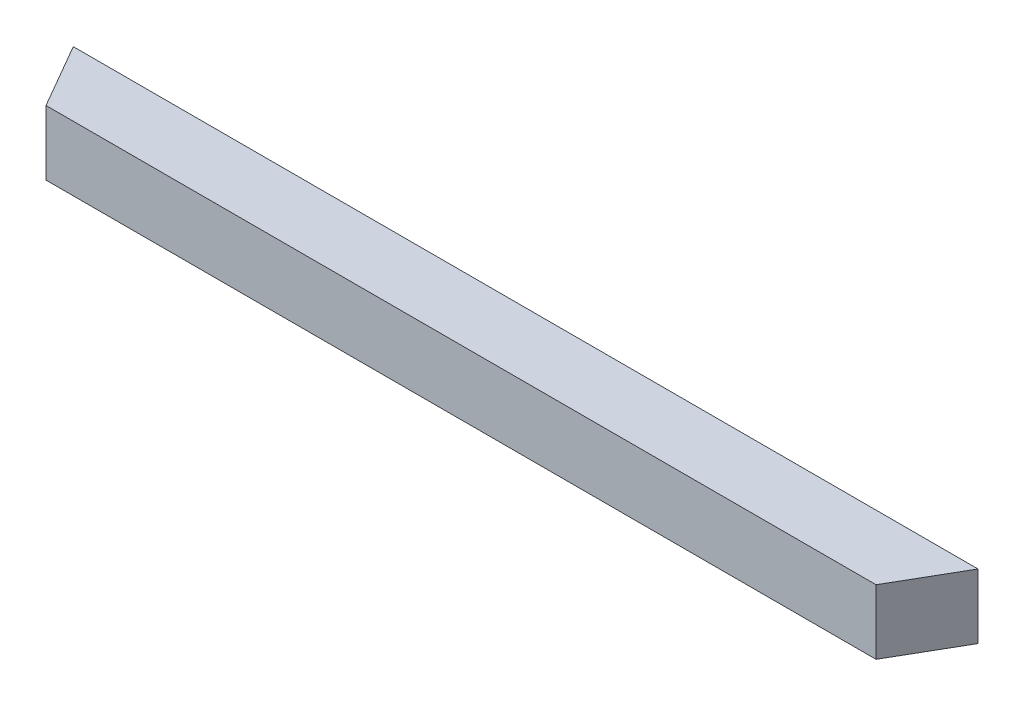
ISO-10303-21;
HEADER;
FILE_DESCRIPTION(('STEP AP214'),'2;1');
FILE_NAME('part.step','',(''),(''),'','','');
FILE_SCHEMA(('AUTOMOTIVE_DESIGN { 1 0 10303 214 1 1 1 1 }'));
ENDSEC;
DATA;
#1=APPLICATION_CONTEXT('core data for automotive mechanical design processes');
#2=APPLICATION_PROTOCOL_DEFINITION('international standard','automotive_design',2000,#1);
#3=PRODUCT_CONTEXT('',#1,'mechanical');
#4=PRODUCT('Part','Part','',(#3));
#5=PRODUCT_RELATED_PRODUCT_CATEGORY('part','',(#4));
#6=PRODUCT_DEFINITION_FORMATION('','',#4);
#7=PRODUCT_DEFINITION_CONTEXT('part definition',#1,'design');
#8=PRODUCT_DEFINITION('design','',#6,#7);
#9=PRODUCT_DEFINITION_SHAPE('','',#8);
#10=(LENGTH_UNIT() NAMED_UNIT(*) SI_UNIT(.MILLI.,.METRE.));
#11=(NAMED_UNIT(*) PLANE_ANGLE_UNIT() SI_UNIT($,.RADIAN.));
#12=(NAMED_UNIT(*) SI_UNIT($,.STERADIAN.) SOLID_ANGLE_UNIT());
#13=UNCERTAINTY_MEASURE_WITH_UNIT(LENGTH_MEASURE(1.E-05),#10,'distance_accuracy_value','');
#14=(GEOMETRIC_REPRESENTATION_CONTEXT(3) GLOBAL_UNCERTAINTY_ASSIGNED_CONTEXT((#13)) GLOBAL_UNIT_ASSIGNED_CONTEXT((#10,
#11,#12)) REPRESENTATION_CONTEXT('',''));
#15=CARTESIAN_POINT('',(0.,0.,0.));
#16=DIRECTION('',(0.,0.,1.));
#17=DIRECTION('',(1.,0.,0.));
#18=AXIS2_PLACEMENT_3D('',#15,#16,#17);
#19=CARTESIAN_POINT('',(128.452994616208,20.,20.));
#20=DIRECTION('',(-0.86602540378444,0.,-0.499999999999998));
#21=DIRECTION('',(-0.499999999999998,0.,0.86602540378444));
#22=AXIS2_PLACEMENT_3D('',#19,#20,#21);
#23=PLANE('',#22);
#24=DIRECTION('',(0.499999999999998,0.,-0.86602540378444));
#25=VECTOR('',#24,1.);
#26=CARTESIAN_POINT('',(128.452994616208,0.,20.));
#27=LINE('',#26,#25);
#28=CARTESIAN_POINT('',(128.452994616208,0.,20.));
#29=VERTEX_POINT('',#28);
#30=CARTESIAN_POINT('',(140.,0.,0.));
#31=VERTEX_POINT('',#30);
#32=EDGE_CURVE('E96',#29,#31,#27,.T.);
#33=ORIENTED_EDGE('',*,*,#32,.T.);
#34=DIRECTION('',(0.,-1.,0.));
#35=VECTOR('',#34,1.);
#36=CARTESIAN_POINT('',(140.,20.,0.));
#37=LINE('',#36,#35);
#38=CARTESIAN_POINT('',(140.,20.,0.));
#39=VERTEX_POINT('',#38);
#40=EDGE_CURVE('E11',#39,#31,#37,.T.);
#41=ORIENTED_EDGE('',*,*,#40,.F.);
#42=DIRECTION('',(0.499999999999998,0.,-0.86602540378444));
#43=VECTOR('',#42,1.);
#44=CARTESIAN_POINT('',(128.452994616208,20.,20.));
#45=LINE('',#44,#43);
#46=CARTESIAN_POINT('',(128.452994616208,20.,20.));
#47=VERTEX_POINT('',#46);
#48=EDGE_CURVE('E84',#47,#39,#45,.T.);
#49=ORIENTED_EDGE('',*,*,#48,.F.);
#50=DIRECTION('',(0.,-1.,0.));
#51=VECTOR('',#50,1.);
#52=CARTESIAN_POINT('',(128.452994616208,20.,20.));
#53=LINE('',#52,#51);
#54=EDGE_CURVE('E92',#47,#29,#53,.T.);
#55=ORIENTED_EDGE('',*,*,#54,.T.);
#56=EDGE_LOOP('',(#33,#41,#49,#55));
#57=FACE_BOUND('',#56,.T.);
#58=ADVANCED_FACE('F33',(#57),#23,.F.);
#59=CARTESIAN_POINT('',(-140.,20.,0.));
#60=DIRECTION('',(0.,0.,1.));
#61=DIRECTION('',(1.,0.,0.));
#62=AXIS2_PLACEMENT_3D('',#59,#60,#61);
#63=PLANE('',#62);
#64=DIRECTION('',(-1.,0.,0.));
#65=VECTOR('',#64,1.);
#66=CARTESIAN_POINT('',(-140.,0.,0.));
#67=LINE('',#66,#65);
#68=CARTESIAN_POINT('',(-140.,0.,0.));
#69=VERTEX_POINT('',#68);
#70=EDGE_CURVE('E88',#31,#69,#67,.T.);
#71=ORIENTED_EDGE('',*,*,#70,.T.);
#72=DIRECTION('',(0.,-1.,0.));
#73=VECTOR('',#72,1.);
#74=CARTESIAN_POINT('',(-140.,20.,0.));
#75=LINE('',#74,#73);
#76=CARTESIAN_POINT('',(-140.,20.,0.));
#77=VERTEX_POINT('',#76);
#78=EDGE_CURVE('E41',#77,#69,#75,.T.);
#79=ORIENTED_EDGE('',*,*,#78,.F.);
#80=DIRECTION('',(-1.,0.,0.));
#81=VECTOR('',#80,1.);
#82=CARTESIAN_POINT('',(-140.,20.,0.));
#83=LINE('',#82,#81);
#84=EDGE_CURVE('E79',#39,#77,#83,.T.);
#85=ORIENTED_EDGE('',*,*,#84,.F.);
#86=ORIENTED_EDGE('',*,*,#40,.T.);
#87=EDGE_LOOP('',(#71,#79,#85,#86));
#88=FACE_BOUND('',#87,.T.);
#89=ADVANCED_FACE('F87',(#88),#63,.F.);
#90=CARTESIAN_POINT('',(-128.452994616207,20.,20.));
#91=DIRECTION('',(0.866025403784436,0.,-0.500000000000005));
#92=DIRECTION('',(-0.500000000000005,0.,-0.866025403784436));
#93=AXIS2_PLACEMENT_3D('',#90,#91,#92);
#94=PLANE('',#93);
#95=DIRECTION('',(0.500000000000005,0.,0.866025403784436));
#96=VECTOR('',#95,1.);
#97=CARTESIAN_POINT('',(-128.452994616207,0.,20.));
#98=LINE('',#97,#96);
#99=CARTESIAN_POINT('',(-128.452994616207,0.,20.));
#100=VERTEX_POINT('',#99);
#101=EDGE_CURVE('E66',#69,#100,#98,.T.);
#102=ORIENTED_EDGE('',*,*,#101,.T.);
#103=DIRECTION('',(0.,-1.,0.));
#104=VECTOR('',#103,1.);
#105=CARTESIAN_POINT('',(-128.452994616207,20.,20.));
#106=LINE('',#105,#104);
#107=CARTESIAN_POINT('',(-128.452994616207,20.,20.));
#108=VERTEX_POINT('',#107);
#109=EDGE_CURVE('E89',#108,#100,#106,.T.);
#110=ORIENTED_EDGE('',*,*,#109,.F.);
#111=DIRECTION('',(0.500000000000005,0.,0.866025403784436));
#112=VECTOR('',#111,1.);
#113=CARTESIAN_POINT('',(-128.452994616207,20.,20.));
#114=LINE('',#113,#112);
#115=EDGE_CURVE('E82',#77,#108,#114,.T.);
#116=ORIENTED_EDGE('',*,*,#115,.F.);
#117=ORIENTED_EDGE('',*,*,#78,.T.);
#118=EDGE_LOOP('',(#102,#110,#116,#117));
#119=FACE_BOUND('',#118,.T.);
#120=ADVANCED_FACE('F90',(#119),#94,.F.);
#121=CARTESIAN_POINT('',(-128.452994616207,20.,20.));
#122=DIRECTION('',(0.,0.,-1.));
#123=DIRECTION('',(-1.,0.,0.));
#124=AXIS2_PLACEMENT_3D('',#121,#122,#123);
#125=PLANE('',#124);
#126=DIRECTION('',(1.,0.,0.));
#127=VECTOR('',#126,1.);
#128=CARTESIAN_POINT('',(-128.452994616207,0.,20.));
#129=LINE('',#128,#127);
#130=EDGE_CURVE('E72',#100,#29,#129,.T.);
#131=ORIENTED_EDGE('',*,*,#130,.T.);
#132=ORIENTED_EDGE('',*,*,#54,.F.);
#133=DIRECTION('',(1.,0.,0.));
#134=VECTOR('',#133,1.);
#135=CARTESIAN_POINT('',(-128.452994616207,20.,20.));
#136=LINE('',#135,#134);
#137=EDGE_CURVE('E49',#108,#47,#136,.T.);
#138=ORIENTED_EDGE('',*,*,#137,.F.);
#139=ORIENTED_EDGE('',*,*,#109,.T.);
#140=EDGE_LOOP('',(#131,#132,#138,#139));
#141=FACE_BOUND('',#140,.T.);
#142=ADVANCED_FACE('F103',(#141),#125,.F.);
#143=CARTESIAN_POINT('',(0.,20.,0.));
#144=DIRECTION('',(0.,-1.,0.));
#145=DIRECTION('',(0.,0.,-1.));
#146=AXIS2_PLACEMENT_3D('',#143,#144,#145);
#147=PLANE('',#146);
#148=ORIENTED_EDGE('',*,*,#48,.T.);
#149=ORIENTED_EDGE('',*,*,#84,.T.);
#150=ORIENTED_EDGE('',*,*,#115,.T.);
#151=ORIENTED_EDGE('',*,*,#137,.T.);
#152=EDGE_LOOP('',(#148,#149,#150,#151));
#153=FACE_BOUND('',#152,.T.);
#154=ADVANCED_FACE('F80',(#153),#147,.F.);
#155=CARTESIAN_POINT('',(0.,0.,0.));
#156=DIRECTION('',(0.,-1.,0.));
#157=DIRECTION('',(0.,0.,-1.));
#158=AXIS2_PLACEMENT_3D('',#155,#156,#157);
#159=PLANE('',#158);
#160=ORIENTED_EDGE('',*,*,#32,.F.);
#161=ORIENTED_EDGE('',*,*,#130,.F.);
#162=ORIENTED_EDGE('',*,*,#101,.F.);
#163=ORIENTED_EDGE('',*,*,#70,.F.);
#164=EDGE_LOOP('',(#160,#161,#162,#163));
#165=FACE_BOUND('',#164,.T.);
#166=ADVANCED_FACE('F106',(#165),#159,.T.);
#167=CLOSED_SHELL('',(#58,#89,#120,#142,#154,#166));
#168=MANIFOLD_SOLID_BREP('B2',#167);
#169=ADVANCED_BREP_SHAPE_REPRESENTATION('',(#18,#168),#14);
#170=SHAPE_DEFINITION_REPRESENTATION(#9,#169);
ENDSEC;
END-ISO-10303-21;
